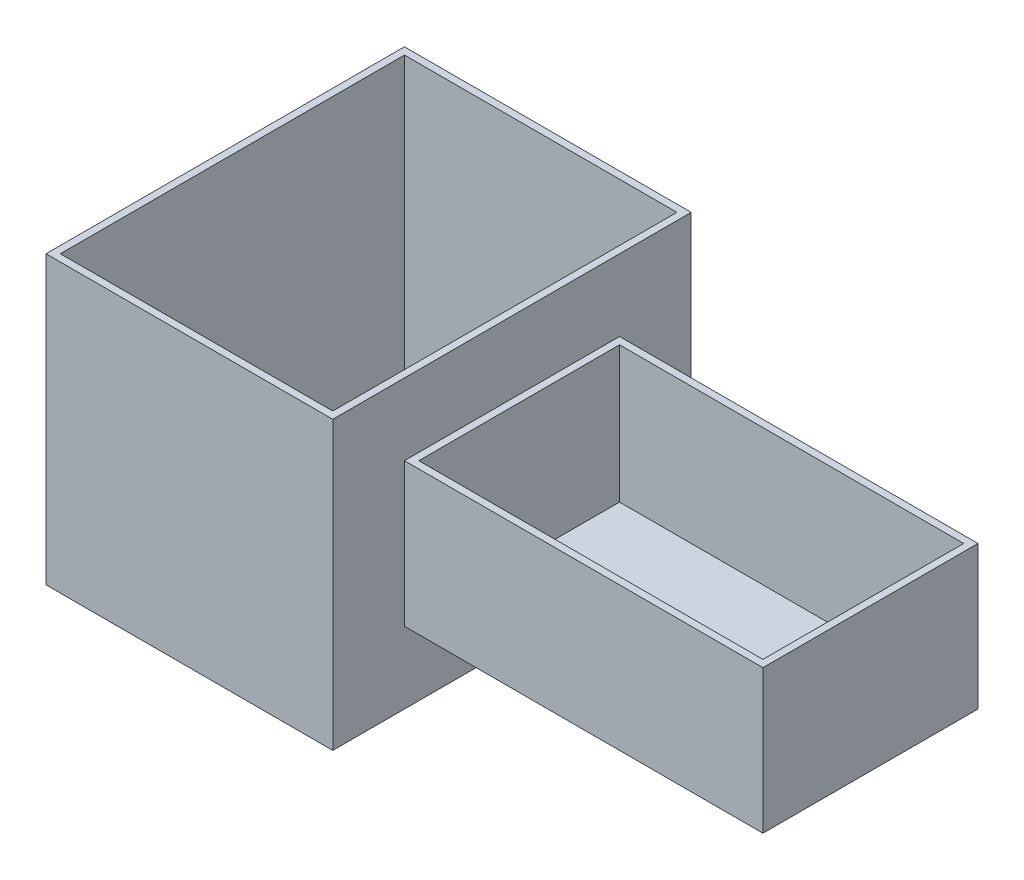
ISO-10303-21;
HEADER;
FILE_DESCRIPTION(('STEP AP214'),'2;1');
FILE_NAME('part.step','',(''),(''),'','','');
FILE_SCHEMA(('AUTOMOTIVE_DESIGN { 1 0 10303 214 1 1 1 1 }'));
ENDSEC;
DATA;
#1=APPLICATION_CONTEXT('core data for automotive mechanical design processes');
#2=APPLICATION_PROTOCOL_DEFINITION('international standard','automotive_design',2000,#1);
#3=PRODUCT_CONTEXT('',#1,'mechanical');
#4=PRODUCT('Part','Part','',(#3));
#5=PRODUCT_RELATED_PRODUCT_CATEGORY('part','',(#4));
#6=PRODUCT_DEFINITION_FORMATION('','',#4);
#7=PRODUCT_DEFINITION_CONTEXT('part definition',#1,'design');
#8=PRODUCT_DEFINITION('design','',#6,#7);
#9=PRODUCT_DEFINITION_SHAPE('','',#8);
#10=(LENGTH_UNIT() NAMED_UNIT(*) SI_UNIT(.MILLI.,.METRE.));
#11=(NAMED_UNIT(*) PLANE_ANGLE_UNIT() SI_UNIT($,.RADIAN.));
#12=(NAMED_UNIT(*) SI_UNIT($,.STERADIAN.) SOLID_ANGLE_UNIT());
#13=UNCERTAINTY_MEASURE_WITH_UNIT(LENGTH_MEASURE(1.E-05),#10,'distance_accuracy_value','');
#14=(GEOMETRIC_REPRESENTATION_CONTEXT(3) GLOBAL_UNCERTAINTY_ASSIGNED_CONTEXT((#13)) GLOBAL_UNIT_ASSIGNED_CONTEXT((#10,
#11,#12)) REPRESENTATION_CONTEXT('',''));
#15=CARTESIAN_POINT('',(0.,0.,0.));
#16=DIRECTION('',(0.,0.,1.));
#17=DIRECTION('',(1.,0.,0.));
#18=AXIS2_PLACEMENT_3D('',#15,#16,#17);
#19=CARTESIAN_POINT('',(-48.26,101.6,0.));
#20=DIRECTION('',(1.,0.,0.));
#21=DIRECTION('',(0.,0.,-1.));
#22=AXIS2_PLACEMENT_3D('',#19,#20,#21);
#23=PLANE('',#22);
#24=DIRECTION('',(0.,-1.,0.));
#25=VECTOR('',#24,1.);
#26=CARTESIAN_POINT('',(-48.26,101.6,60.96));
#27=LINE('',#26,#25);
#28=CARTESIAN_POINT('',(-48.26,101.6,60.96));
#29=VERTEX_POINT('',#28);
#30=CARTESIAN_POINT('',(-48.26,2.54,60.96));
#31=VERTEX_POINT('',#30);
#32=EDGE_CURVE('E284',#29,#31,#27,.T.);
#33=ORIENTED_EDGE('',*,*,#32,.T.);
#34=DIRECTION('',(0.,0.,-1.));
#35=VECTOR('',#34,1.);
#36=CARTESIAN_POINT('',(-48.26,2.54,0.));
#37=LINE('',#36,#35);
#38=CARTESIAN_POINT('',(-48.26,2.54,-60.96));
#39=VERTEX_POINT('',#38);
#40=EDGE_CURVE('E263',#31,#39,#37,.T.);
#41=ORIENTED_EDGE('',*,*,#40,.T.);
#42=DIRECTION('',(0.,-1.,0.));
#43=VECTOR('',#42,1.);
#44=CARTESIAN_POINT('',(-48.26,101.6,-60.96));
#45=LINE('',#44,#43);
#46=CARTESIAN_POINT('',(-48.26,101.6,-60.96));
#47=VERTEX_POINT('',#46);
#48=EDGE_CURVE('E275',#47,#39,#45,.T.);
#49=ORIENTED_EDGE('',*,*,#48,.F.);
#50=DIRECTION('',(0.,0.,1.));
#51=VECTOR('',#50,1.);
#52=CARTESIAN_POINT('',(-48.26,101.6,0.));
#53=LINE('',#52,#51);
#54=EDGE_CURVE('E266',#47,#29,#53,.T.);
#55=ORIENTED_EDGE('',*,*,#54,.T.);
#56=EDGE_LOOP('',(#33,#41,#49,#55));
#57=FACE_BOUND('',#56,.T.);
#58=ADVANCED_FACE('F82',(#57),#23,.T.);
#59=CARTESIAN_POINT('',(0.,101.6,60.96));
#60=DIRECTION('',(0.,0.,-1.));
#61=DIRECTION('',(-1.,0.,0.));
#62=AXIS2_PLACEMENT_3D('',#59,#60,#61);
#63=PLANE('',#62);
#64=DIRECTION('',(0.,-1.,0.));
#65=VECTOR('',#64,1.);
#66=CARTESIAN_POINT('',(48.26,101.6,60.96));
#67=LINE('',#66,#65);
#68=CARTESIAN_POINT('',(48.26,101.6,60.96));
#69=VERTEX_POINT('',#68);
#70=CARTESIAN_POINT('',(48.26,2.54,60.96));
#71=VERTEX_POINT('',#70);
#72=EDGE_CURVE('E281',#69,#71,#67,.T.);
#73=ORIENTED_EDGE('',*,*,#72,.T.);
#74=DIRECTION('',(-1.,0.,0.));
#75=VECTOR('',#74,1.);
#76=CARTESIAN_POINT('',(0.,2.54,60.96));
#77=LINE('',#76,#75);
#78=EDGE_CURVE('E260',#71,#31,#77,.T.);
#79=ORIENTED_EDGE('',*,*,#78,.T.);
#80=ORIENTED_EDGE('',*,*,#32,.F.);
#81=DIRECTION('',(1.,0.,0.));
#82=VECTOR('',#81,1.);
#83=CARTESIAN_POINT('',(0.,101.6,60.96));
#84=LINE('',#83,#82);
#85=EDGE_CURVE('E268',#29,#69,#84,.T.);
#86=ORIENTED_EDGE('',*,*,#85,.T.);
#87=EDGE_LOOP('',(#73,#79,#80,#86));
#88=FACE_BOUND('',#87,.T.);
#89=ADVANCED_FACE('F333',(#88),#63,.T.);
#90=CARTESIAN_POINT('',(48.26,101.6,0.));
#91=DIRECTION('',(-1.,0.,0.));
#92=DIRECTION('',(0.,0.,1.));
#93=AXIS2_PLACEMENT_3D('',#90,#91,#92);
#94=PLANE('',#93);
#95=DIRECTION('',(0.,-1.,0.));
#96=VECTOR('',#95,1.);
#97=CARTESIAN_POINT('',(48.26,101.6,-60.96));
#98=LINE('',#97,#96);
#99=CARTESIAN_POINT('',(48.26,101.6,-60.96));
#100=VERTEX_POINT('',#99);
#101=CARTESIAN_POINT('',(48.26,2.54,-60.96));
#102=VERTEX_POINT('',#101);
#103=EDGE_CURVE('E278',#100,#102,#98,.T.);
#104=ORIENTED_EDGE('',*,*,#103,.T.);
#105=DIRECTION('',(0.,0.,1.));
#106=VECTOR('',#105,1.);
#107=CARTESIAN_POINT('',(48.26,2.54,0.));
#108=LINE('',#107,#106);
#109=EDGE_CURVE('E257',#102,#71,#108,.T.);
#110=ORIENTED_EDGE('',*,*,#109,.T.);
#111=ORIENTED_EDGE('',*,*,#72,.F.);
#112=DIRECTION('',(0.,0.,-1.));
#113=VECTOR('',#112,1.);
#114=CARTESIAN_POINT('',(48.26,101.6,0.));
#115=LINE('',#114,#113);
#116=EDGE_CURVE('E270',#69,#100,#115,.T.);
#117=ORIENTED_EDGE('',*,*,#116,.T.);
#118=EDGE_LOOP('',(#104,#110,#111,#117));
#119=FACE_BOUND('',#118,.T.);
#120=ADVANCED_FACE('F321',(#119),#94,.T.);
#121=CARTESIAN_POINT('',(0.,101.6,-60.96));
#122=DIRECTION('',(0.,0.,1.));
#123=DIRECTION('',(1.,0.,0.));
#124=AXIS2_PLACEMENT_3D('',#121,#122,#123);
#125=PLANE('',#124);
#126=ORIENTED_EDGE('',*,*,#48,.T.);
#127=DIRECTION('',(1.,0.,0.));
#128=VECTOR('',#127,1.);
#129=CARTESIAN_POINT('',(0.,2.54,-60.96));
#130=LINE('',#129,#128);
#131=EDGE_CURVE('E90',#39,#102,#130,.T.);
#132=ORIENTED_EDGE('',*,*,#131,.T.);
#133=ORIENTED_EDGE('',*,*,#103,.F.);
#134=DIRECTION('',(-1.,0.,0.));
#135=VECTOR('',#134,1.);
#136=CARTESIAN_POINT('',(0.,101.6,-60.96));
#137=LINE('',#136,#135);
#138=EDGE_CURVE('E273',#100,#47,#137,.T.);
#139=ORIENTED_EDGE('',*,*,#138,.T.);
#140=EDGE_LOOP('',(#126,#132,#133,#139));
#141=FACE_BOUND('',#140,.T.);
#142=ADVANCED_FACE('F317',(#141),#125,.T.);
#143=CARTESIAN_POINT('',(0.,101.6,0.));
#144=DIRECTION('',(0.,1.,0.));
#145=DIRECTION('',(0.,0.,1.));
#146=AXIS2_PLACEMENT_3D('',#143,#144,#145);
#147=PLANE('',#146);
#148=DIRECTION('',(0.,0.,1.));
#149=VECTOR('',#148,1.);
#150=CARTESIAN_POINT('',(-50.8,101.6,-63.5));
#151=LINE('',#150,#149);
#152=CARTESIAN_POINT('',(-50.8,101.6,-63.5));
#153=VERTEX_POINT('',#152);
#154=CARTESIAN_POINT('',(-50.8,101.6,63.5));
#155=VERTEX_POINT('',#154);
#156=EDGE_CURVE('E288',#153,#155,#151,.T.);
#157=ORIENTED_EDGE('',*,*,#156,.T.);
#158=DIRECTION('',(1.,0.,0.));
#159=VECTOR('',#158,1.);
#160=CARTESIAN_POINT('',(50.8,101.6,63.5));
#161=LINE('',#160,#159);
#162=CARTESIAN_POINT('',(50.8,101.6,63.5));
#163=VERTEX_POINT('',#162);
#164=EDGE_CURVE('E291',#155,#163,#161,.T.);
#165=ORIENTED_EDGE('',*,*,#164,.T.);
#166=DIRECTION('',(0.,0.,-1.));
#167=VECTOR('',#166,1.);
#168=CARTESIAN_POINT('',(50.8,101.6,-63.5));
#169=LINE('',#168,#167);
#170=CARTESIAN_POINT('',(50.8,101.6,-63.5));
#171=VERTEX_POINT('',#170);
#172=EDGE_CURVE('E294',#163,#171,#169,.T.);
#173=ORIENTED_EDGE('',*,*,#172,.T.);
#174=DIRECTION('',(-1.,0.,0.));
#175=VECTOR('',#174,1.);
#176=CARTESIAN_POINT('',(50.8,101.6,-63.5));
#177=LINE('',#176,#175);
#178=EDGE_CURVE('E296',#171,#153,#177,.T.);
#179=ORIENTED_EDGE('',*,*,#178,.T.);
#180=EDGE_LOOP('',(#157,#165,#173,#179));
#181=FACE_BOUND('',#180,.T.);
#182=ORIENTED_EDGE('',*,*,#85,.F.);
#183=ORIENTED_EDGE('',*,*,#54,.F.);
#184=ORIENTED_EDGE('',*,*,#138,.F.);
#185=ORIENTED_EDGE('',*,*,#116,.F.);
#186=EDGE_LOOP('',(#182,#183,#184,#185));
#187=FACE_BOUND('',#186,.T.);
#188=ADVANCED_FACE('F328',(#181,#187),#147,.T.);
#189=CARTESIAN_POINT('',(0.,0.,0.));
#190=DIRECTION('',(0.,1.,0.));
#191=DIRECTION('',(0.,0.,1.));
#192=AXIS2_PLACEMENT_3D('',#189,#190,#191);
#193=PLANE('',#192);
#194=DIRECTION('',(0.,0.,1.));
#195=VECTOR('',#194,1.);
#196=CARTESIAN_POINT('',(-50.8,0.,-63.5));
#197=LINE('',#196,#195);
#198=CARTESIAN_POINT('',(-50.8,0.,-63.5));
#199=VERTEX_POINT('',#198);
#200=CARTESIAN_POINT('',(-50.8,0.,63.5));
#201=VERTEX_POINT('',#200);
#202=EDGE_CURVE('E287',#199,#201,#197,.T.);
#203=ORIENTED_EDGE('',*,*,#202,.F.);
#204=DIRECTION('',(-1.,0.,0.));
#205=VECTOR('',#204,1.);
#206=CARTESIAN_POINT('',(50.8,0.,-63.5));
#207=LINE('',#206,#205);
#208=CARTESIAN_POINT('',(50.8,0.,-63.5));
#209=VERTEX_POINT('',#208);
#210=EDGE_CURVE('E292',#209,#199,#207,.T.);
#211=ORIENTED_EDGE('',*,*,#210,.F.);
#212=DIRECTION('',(0.,0.,-1.));
#213=VECTOR('',#212,1.);
#214=CARTESIAN_POINT('',(50.8,0.,-63.5));
#215=LINE('',#214,#213);
#216=CARTESIAN_POINT('',(50.8,0.,63.5));
#217=VERTEX_POINT('',#216);
#218=EDGE_CURVE('E304',#217,#209,#215,.T.);
#219=ORIENTED_EDGE('',*,*,#218,.F.);
#220=DIRECTION('',(1.,0.,0.));
#221=VECTOR('',#220,1.);
#222=CARTESIAN_POINT('',(50.8,0.,63.5));
#223=LINE('',#222,#221);
#224=EDGE_CURVE('E301',#201,#217,#223,.T.);
#225=ORIENTED_EDGE('',*,*,#224,.F.);
#226=EDGE_LOOP('',(#203,#211,#219,#225));
#227=FACE_BOUND('',#226,.T.);
#228=ADVANCED_FACE('F346',(#227),#193,.F.);
#229=CARTESIAN_POINT('',(-50.8,101.6,-63.5));
#230=DIRECTION('',(1.,0.,0.));
#231=DIRECTION('',(0.,0.,-1.));
#232=AXIS2_PLACEMENT_3D('',#229,#230,#231);
#233=PLANE('',#232);
#234=ORIENTED_EDGE('',*,*,#202,.T.);
#235=DIRECTION('',(0.,-1.,0.));
#236=VECTOR('',#235,1.);
#237=CARTESIAN_POINT('',(-50.8,101.6,63.5));
#238=LINE('',#237,#236);
#239=EDGE_CURVE('E314',#155,#201,#238,.T.);
#240=ORIENTED_EDGE('',*,*,#239,.F.);
#241=ORIENTED_EDGE('',*,*,#156,.F.);
#242=DIRECTION('',(0.,-1.,0.));
#243=VECTOR('',#242,1.);
#244=CARTESIAN_POINT('',(-50.8,101.6,-63.5));
#245=LINE('',#244,#243);
#246=EDGE_CURVE('E298',#153,#199,#245,.T.);
#247=ORIENTED_EDGE('',*,*,#246,.T.);
#248=EDGE_LOOP('',(#234,#240,#241,#247));
#249=FACE_BOUND('',#248,.T.);
#250=ADVANCED_FACE('F84',(#249),#233,.F.);
#251=CARTESIAN_POINT('',(50.8,101.6,63.5));
#252=DIRECTION('',(0.,0.,-1.));
#253=DIRECTION('',(-1.,0.,0.));
#254=AXIS2_PLACEMENT_3D('',#251,#252,#253);
#255=PLANE('',#254);
#256=ORIENTED_EDGE('',*,*,#224,.T.);
#257=DIRECTION('',(0.,-1.,0.));
#258=VECTOR('',#257,1.);
#259=CARTESIAN_POINT('',(50.8,101.6,63.5));
#260=LINE('',#259,#258);
#261=EDGE_CURVE('E312',#163,#217,#260,.T.);
#262=ORIENTED_EDGE('',*,*,#261,.F.);
#263=ORIENTED_EDGE('',*,*,#164,.F.);
#264=ORIENTED_EDGE('',*,*,#239,.T.);
#265=EDGE_LOOP('',(#256,#262,#263,#264));
#266=FACE_BOUND('',#265,.T.);
#267=ADVANCED_FACE('F357',(#266),#255,.F.);
#268=CARTESIAN_POINT('',(50.8,101.6,-63.5));
#269=DIRECTION('',(-1.,0.,0.));
#270=DIRECTION('',(0.,0.,1.));
#271=AXIS2_PLACEMENT_3D('',#268,#269,#270);
#272=PLANE('',#271);
#273=DIRECTION('',(0.,-1.,0.));
#274=VECTOR('',#273,1.);
#275=CARTESIAN_POINT('',(50.8,76.2,-38.1));
#276=LINE('',#275,#274);
#277=CARTESIAN_POINT('',(50.8,76.2,-38.1));
#278=VERTEX_POINT('',#277);
#279=CARTESIAN_POINT('',(50.8,25.4,-38.1));
#280=VERTEX_POINT('',#279);
#281=EDGE_CURVE('E239',#278,#280,#276,.T.);
#282=ORIENTED_EDGE('',*,*,#281,.T.);
#283=DIRECTION('',(0.,0.,1.));
#284=VECTOR('',#283,1.);
#285=CARTESIAN_POINT('',(50.8,25.4,-38.1));
#286=LINE('',#285,#284);
#287=CARTESIAN_POINT('',(50.8,25.4,38.1));
#288=VERTEX_POINT('',#287);
#289=EDGE_CURVE('E228',#280,#288,#286,.T.);
#290=ORIENTED_EDGE('',*,*,#289,.T.);
#291=DIRECTION('',(0.,-1.,0.));
#292=VECTOR('',#291,1.);
#293=CARTESIAN_POINT('',(50.8,76.2,38.1));
#294=LINE('',#293,#292);
#295=CARTESIAN_POINT('',(50.8,76.2,38.1));
#296=VERTEX_POINT('',#295);
#297=EDGE_CURVE('E255',#296,#288,#294,.T.);
#298=ORIENTED_EDGE('',*,*,#297,.F.);
#299=DIRECTION('',(0.,0.,1.));
#300=VECTOR('',#299,1.);
#301=CARTESIAN_POINT('',(50.8,76.2,-38.1));
#302=LINE('',#301,#300);
#303=EDGE_CURVE('E229',#278,#296,#302,.T.);
#304=ORIENTED_EDGE('',*,*,#303,.F.);
#305=EDGE_LOOP('',(#282,#290,#298,#304));
#306=FACE_BOUND('',#305,.T.);
#307=ORIENTED_EDGE('',*,*,#218,.T.);
#308=DIRECTION('',(0.,-1.,0.));
#309=VECTOR('',#308,1.);
#310=CARTESIAN_POINT('',(50.8,101.6,-63.5));
#311=LINE('',#310,#309);
#312=EDGE_CURVE('E310',#171,#209,#311,.T.);
#313=ORIENTED_EDGE('',*,*,#312,.F.);
#314=ORIENTED_EDGE('',*,*,#172,.F.);
#315=ORIENTED_EDGE('',*,*,#261,.T.);
#316=EDGE_LOOP('',(#307,#313,#314,#315));
#317=FACE_BOUND('',#316,.T.);
#318=ADVANCED_FACE('F354',(#306,#317),#272,.F.);
#319=CARTESIAN_POINT('',(50.8,101.6,-63.5));
#320=DIRECTION('',(0.,0.,1.));
#321=DIRECTION('',(1.,0.,0.));
#322=AXIS2_PLACEMENT_3D('',#319,#320,#321);
#323=PLANE('',#322);
#324=ORIENTED_EDGE('',*,*,#210,.T.);
#325=ORIENTED_EDGE('',*,*,#246,.F.);
#326=ORIENTED_EDGE('',*,*,#178,.F.);
#327=ORIENTED_EDGE('',*,*,#312,.T.);
#328=EDGE_LOOP('',(#324,#325,#326,#327));
#329=FACE_BOUND('',#328,.T.);
#330=ADVANCED_FACE('F351',(#329),#323,.F.);
#331=CARTESIAN_POINT('',(0.,2.54,0.));
#332=DIRECTION('',(0.,-1.,0.));
#333=DIRECTION('',(0.,0.,-1.));
#334=AXIS2_PLACEMENT_3D('',#331,#332,#333);
#335=PLANE('',#334);
#336=ORIENTED_EDGE('',*,*,#40,.F.);
#337=ORIENTED_EDGE('',*,*,#78,.F.);
#338=ORIENTED_EDGE('',*,*,#109,.F.);
#339=ORIENTED_EDGE('',*,*,#131,.F.);
#340=EDGE_LOOP('',(#336,#337,#338,#339));
#341=FACE_BOUND('',#340,.T.);
#342=ADVANCED_FACE('F331',(#341),#335,.F.);
#343=CARTESIAN_POINT('',(0.,76.2,0.));
#344=DIRECTION('',(0.,1.,0.));
#345=DIRECTION('',(0.,0.,1.));
#346=AXIS2_PLACEMENT_3D('',#343,#344,#345);
#347=PLANE('',#346);
#348=ORIENTED_EDGE('',*,*,#303,.T.);
#349=DIRECTION('',(1.,0.,0.));
#350=VECTOR('',#349,1.);
#351=CARTESIAN_POINT('',(50.8,76.2,38.1));
#352=LINE('',#351,#350);
#353=CARTESIAN_POINT('',(177.8,76.2,38.1));
#354=VERTEX_POINT('',#353);
#355=EDGE_CURVE('E232',#296,#354,#352,.T.);
#356=ORIENTED_EDGE('',*,*,#355,.T.);
#357=DIRECTION('',(0.,0.,-1.));
#358=VECTOR('',#357,1.);
#359=CARTESIAN_POINT('',(177.8,76.2,-38.1));
#360=LINE('',#359,#358);
#361=CARTESIAN_POINT('',(177.8,76.2,-38.1));
#362=VERTEX_POINT('',#361);
#363=EDGE_CURVE('E235',#354,#362,#360,.T.);
#364=ORIENTED_EDGE('',*,*,#363,.T.);
#365=DIRECTION('',(-1.,0.,0.));
#366=VECTOR('',#365,1.);
#367=CARTESIAN_POINT('',(50.8,76.2,-38.1));
#368=LINE('',#367,#366);
#369=EDGE_CURVE('E237',#362,#278,#368,.T.);
#370=ORIENTED_EDGE('',*,*,#369,.T.);
#371=EDGE_LOOP('',(#348,#356,#364,#370));
#372=FACE_BOUND('',#371,.T.);
#373=DIRECTION('',(1.,0.,0.));
#374=VECTOR('',#373,1.);
#375=CARTESIAN_POINT('',(50.8,76.2,35.56));
#376=LINE('',#375,#374);
#377=CARTESIAN_POINT('',(53.34,76.2,35.56));
#378=VERTEX_POINT('',#377);
#379=CARTESIAN_POINT('',(175.26,76.2,35.56));
#380=VERTEX_POINT('',#379);
#381=EDGE_CURVE('E218',#378,#380,#376,.T.);
#382=ORIENTED_EDGE('',*,*,#381,.F.);
#383=DIRECTION('',(0.,0.,1.));
#384=VECTOR('',#383,1.);
#385=CARTESIAN_POINT('',(53.34,76.2,-38.1));
#386=LINE('',#385,#384);
#387=CARTESIAN_POINT('',(53.34,76.2,-35.56));
#388=VERTEX_POINT('',#387);
#389=EDGE_CURVE('E211',#388,#378,#386,.T.);
#390=ORIENTED_EDGE('',*,*,#389,.F.);
#391=DIRECTION('',(-1.,0.,0.));
#392=VECTOR('',#391,1.);
#393=CARTESIAN_POINT('',(50.8,76.2,-35.56));
#394=LINE('',#393,#392);
#395=CARTESIAN_POINT('',(175.26,76.2,-35.56));
#396=VERTEX_POINT('',#395);
#397=EDGE_CURVE('E201',#396,#388,#394,.T.);
#398=ORIENTED_EDGE('',*,*,#397,.F.);
#399=DIRECTION('',(0.,0.,-1.));
#400=VECTOR('',#399,1.);
#401=CARTESIAN_POINT('',(175.26,76.2,-38.1));
#402=LINE('',#401,#400);
#403=EDGE_CURVE('E220',#380,#396,#402,.T.);
#404=ORIENTED_EDGE('',*,*,#403,.F.);
#405=EDGE_LOOP('',(#382,#390,#398,#404));
#406=FACE_BOUND('',#405,.T.);
#407=ADVANCED_FACE('F421',(#372,#406),#347,.T.);
#408=CARTESIAN_POINT('',(0.,25.4,0.));
#409=DIRECTION('',(0.,1.,0.));
#410=DIRECTION('',(0.,0.,1.));
#411=AXIS2_PLACEMENT_3D('',#408,#409,#410);
#412=PLANE('',#411);
#413=ORIENTED_EDGE('',*,*,#289,.F.);
#414=DIRECTION('',(-1.,0.,0.));
#415=VECTOR('',#414,1.);
#416=CARTESIAN_POINT('',(50.8,25.4,-38.1));
#417=LINE('',#416,#415);
#418=CARTESIAN_POINT('',(177.8,25.4,-38.1));
#419=VERTEX_POINT('',#418);
#420=EDGE_CURVE('E233',#419,#280,#417,.T.);
#421=ORIENTED_EDGE('',*,*,#420,.F.);
#422=DIRECTION('',(0.,0.,-1.));
#423=VECTOR('',#422,1.);
#424=CARTESIAN_POINT('',(177.8,25.4,-38.1));
#425=LINE('',#424,#423);
#426=CARTESIAN_POINT('',(177.8,25.4,38.1));
#427=VERTEX_POINT('',#426);
#428=EDGE_CURVE('E245',#427,#419,#425,.T.);
#429=ORIENTED_EDGE('',*,*,#428,.F.);
#430=DIRECTION('',(1.,0.,0.));
#431=VECTOR('',#430,1.);
#432=CARTESIAN_POINT('',(50.8,25.4,38.1));
#433=LINE('',#432,#431);
#434=EDGE_CURVE('E242',#288,#427,#433,.T.);
#435=ORIENTED_EDGE('',*,*,#434,.F.);
#436=EDGE_LOOP('',(#413,#421,#429,#435));
#437=FACE_BOUND('',#436,.T.);
#438=ADVANCED_FACE('F430',(#437),#412,.F.);
#439=CARTESIAN_POINT('',(50.8,76.2,38.1));
#440=DIRECTION('',(0.,0.,-1.));
#441=DIRECTION('',(-1.,0.,0.));
#442=AXIS2_PLACEMENT_3D('',#439,#440,#441);
#443=PLANE('',#442);
#444=ORIENTED_EDGE('',*,*,#297,.T.);
#445=ORIENTED_EDGE('',*,*,#434,.T.);
#446=DIRECTION('',(0.,-1.,0.));
#447=VECTOR('',#446,1.);
#448=CARTESIAN_POINT('',(177.8,76.2,38.1));
#449=LINE('',#448,#447);
#450=EDGE_CURVE('E253',#354,#427,#449,.T.);
#451=ORIENTED_EDGE('',*,*,#450,.F.);
#452=ORIENTED_EDGE('',*,*,#355,.F.);
#453=EDGE_LOOP('',(#444,#445,#451,#452));
#454=FACE_BOUND('',#453,.T.);
#455=ADVANCED_FACE('F440',(#454),#443,.F.);
#456=CARTESIAN_POINT('',(177.8,76.2,-38.1));
#457=DIRECTION('',(-1.,0.,0.));
#458=DIRECTION('',(0.,0.,1.));
#459=AXIS2_PLACEMENT_3D('',#456,#457,#458);
#460=PLANE('',#459);
#461=ORIENTED_EDGE('',*,*,#450,.T.);
#462=ORIENTED_EDGE('',*,*,#428,.T.);
#463=DIRECTION('',(0.,-1.,0.));
#464=VECTOR('',#463,1.);
#465=CARTESIAN_POINT('',(177.8,76.2,-38.1));
#466=LINE('',#465,#464);
#467=EDGE_CURVE('E251',#362,#419,#466,.T.);
#468=ORIENTED_EDGE('',*,*,#467,.F.);
#469=ORIENTED_EDGE('',*,*,#363,.F.);
#470=EDGE_LOOP('',(#461,#462,#468,#469));
#471=FACE_BOUND('',#470,.T.);
#472=ADVANCED_FACE('F453',(#471),#460,.F.);
#473=CARTESIAN_POINT('',(50.8,76.2,-38.1));
#474=DIRECTION('',(0.,0.,1.));
#475=DIRECTION('',(1.,0.,0.));
#476=AXIS2_PLACEMENT_3D('',#473,#474,#475);
#477=PLANE('',#476);
#478=ORIENTED_EDGE('',*,*,#467,.T.);
#479=ORIENTED_EDGE('',*,*,#420,.T.);
#480=ORIENTED_EDGE('',*,*,#281,.F.);
#481=ORIENTED_EDGE('',*,*,#369,.F.);
#482=EDGE_LOOP('',(#478,#479,#480,#481));
#483=FACE_BOUND('',#482,.T.);
#484=ADVANCED_FACE('F462',(#483),#477,.F.);
#485=CARTESIAN_POINT('',(53.34,76.2,-38.1));
#486=DIRECTION('',(1.,0.,0.));
#487=DIRECTION('',(0.,0.,-1.));
#488=AXIS2_PLACEMENT_3D('',#485,#486,#487);
#489=PLANE('',#488);
#490=DIRECTION('',(0.,0.,1.));
#491=VECTOR('',#490,1.);
#492=CARTESIAN_POINT('',(53.34,27.94,-38.1));
#493=LINE('',#492,#491);
#494=CARTESIAN_POINT('',(53.34,27.94,-35.56));
#495=VERTEX_POINT('',#494);
#496=CARTESIAN_POINT('',(53.34,27.94,35.56));
#497=VERTEX_POINT('',#496);
#498=EDGE_CURVE('E207',#495,#497,#493,.T.);
#499=ORIENTED_EDGE('',*,*,#498,.F.);
#500=DIRECTION('',(0.,-1.,0.));
#501=VECTOR('',#500,1.);
#502=CARTESIAN_POINT('',(53.34,76.2,-35.56));
#503=LINE('',#502,#501);
#504=EDGE_CURVE('E197',#388,#495,#503,.T.);
#505=ORIENTED_EDGE('',*,*,#504,.F.);
#506=ORIENTED_EDGE('',*,*,#389,.T.);
#507=DIRECTION('',(0.,-1.,0.));
#508=VECTOR('',#507,1.);
#509=CARTESIAN_POINT('',(53.34,76.2,35.56));
#510=LINE('',#509,#508);
#511=EDGE_CURVE('E209',#378,#497,#510,.T.);
#512=ORIENTED_EDGE('',*,*,#511,.T.);
#513=EDGE_LOOP('',(#499,#505,#506,#512));
#514=FACE_BOUND('',#513,.T.);
#515=ADVANCED_FACE('F208',(#514),#489,.T.);
#516=CARTESIAN_POINT('',(50.8,76.2,35.56));
#517=DIRECTION('',(0.,0.,-1.));
#518=DIRECTION('',(-1.,0.,0.));
#519=AXIS2_PLACEMENT_3D('',#516,#517,#518);
#520=PLANE('',#519);
#521=DIRECTION('',(1.,0.,0.));
#522=VECTOR('',#521,1.);
#523=CARTESIAN_POINT('',(50.8,27.94,35.56));
#524=LINE('',#523,#522);
#525=CARTESIAN_POINT('',(175.26,27.94,35.56));
#526=VERTEX_POINT('',#525);
#527=EDGE_CURVE('E97',#497,#526,#524,.T.);
#528=ORIENTED_EDGE('',*,*,#527,.F.);
#529=ORIENTED_EDGE('',*,*,#511,.F.);
#530=ORIENTED_EDGE('',*,*,#381,.T.);
#531=DIRECTION('',(0.,-1.,0.));
#532=VECTOR('',#531,1.);
#533=CARTESIAN_POINT('',(175.26,76.2,35.56));
#534=LINE('',#533,#532);
#535=EDGE_CURVE('E225',#380,#526,#534,.T.);
#536=ORIENTED_EDGE('',*,*,#535,.T.);
#537=EDGE_LOOP('',(#528,#529,#530,#536));
#538=FACE_BOUND('',#537,.T.);
#539=ADVANCED_FACE('F479',(#538),#520,.T.);
#540=CARTESIAN_POINT('',(175.26,76.2,-38.1));
#541=DIRECTION('',(-1.,0.,0.));
#542=DIRECTION('',(0.,0.,1.));
#543=AXIS2_PLACEMENT_3D('',#540,#541,#542);
#544=PLANE('',#543);
#545=DIRECTION('',(0.,0.,-1.));
#546=VECTOR('',#545,1.);
#547=CARTESIAN_POINT('',(175.26,27.94,-38.1));
#548=LINE('',#547,#546);
#549=CARTESIAN_POINT('',(175.26,27.94,-35.56));
#550=VERTEX_POINT('',#549);
#551=EDGE_CURVE('E105',#526,#550,#548,.T.);
#552=ORIENTED_EDGE('',*,*,#551,.F.);
#553=ORIENTED_EDGE('',*,*,#535,.F.);
#554=ORIENTED_EDGE('',*,*,#403,.T.);
#555=DIRECTION('',(0.,-1.,0.));
#556=VECTOR('',#555,1.);
#557=CARTESIAN_POINT('',(175.26,76.2,-35.56));
#558=LINE('',#557,#556);
#559=EDGE_CURVE('E204',#396,#550,#558,.T.);
#560=ORIENTED_EDGE('',*,*,#559,.T.);
#561=EDGE_LOOP('',(#552,#553,#554,#560));
#562=FACE_BOUND('',#561,.T.);
#563=ADVANCED_FACE('F487',(#562),#544,.T.);
#564=CARTESIAN_POINT('',(50.8,76.2,-35.56));
#565=DIRECTION('',(0.,0.,1.));
#566=DIRECTION('',(1.,0.,0.));
#567=AXIS2_PLACEMENT_3D('',#564,#565,#566);
#568=PLANE('',#567);
#569=DIRECTION('',(-1.,0.,0.));
#570=VECTOR('',#569,1.);
#571=CARTESIAN_POINT('',(50.8,27.94,-35.56));
#572=LINE('',#571,#570);
#573=EDGE_CURVE('E12',#550,#495,#572,.T.);
#574=ORIENTED_EDGE('',*,*,#573,.F.);
#575=ORIENTED_EDGE('',*,*,#559,.F.);
#576=ORIENTED_EDGE('',*,*,#397,.T.);
#577=ORIENTED_EDGE('',*,*,#504,.T.);
#578=EDGE_LOOP('',(#574,#575,#576,#577));
#579=FACE_BOUND('',#578,.T.);
#580=ADVANCED_FACE('F199',(#579),#568,.T.);
#581=CARTESIAN_POINT('',(0.,27.94,0.));
#582=DIRECTION('',(0.,1.,0.));
#583=DIRECTION('',(0.,0.,1.));
#584=AXIS2_PLACEMENT_3D('',#581,#582,#583);
#585=PLANE('',#584);
#586=ORIENTED_EDGE('',*,*,#573,.T.);
#587=ORIENTED_EDGE('',*,*,#498,.T.);
#588=ORIENTED_EDGE('',*,*,#527,.T.);
#589=ORIENTED_EDGE('',*,*,#551,.T.);
#590=EDGE_LOOP('',(#586,#587,#588,#589));
#591=FACE_BOUND('',#590,.T.);
#592=ADVANCED_FACE('F213',(#591),#585,.T.);
#593=CLOSED_SHELL('',(#58,#89,#120,#142,#188,#228,#250,#267,#318,#330,#342,#407,#438,#455,#472,
#484,#515,#539,#563,#580,#592));
#594=MANIFOLD_SOLID_BREP('B2',#593);
#595=ADVANCED_BREP_SHAPE_REPRESENTATION('',(#18,#594),#14);
#596=SHAPE_DEFINITION_REPRESENTATION(#9,#595);
ENDSEC;
END-ISO-10303-21;
